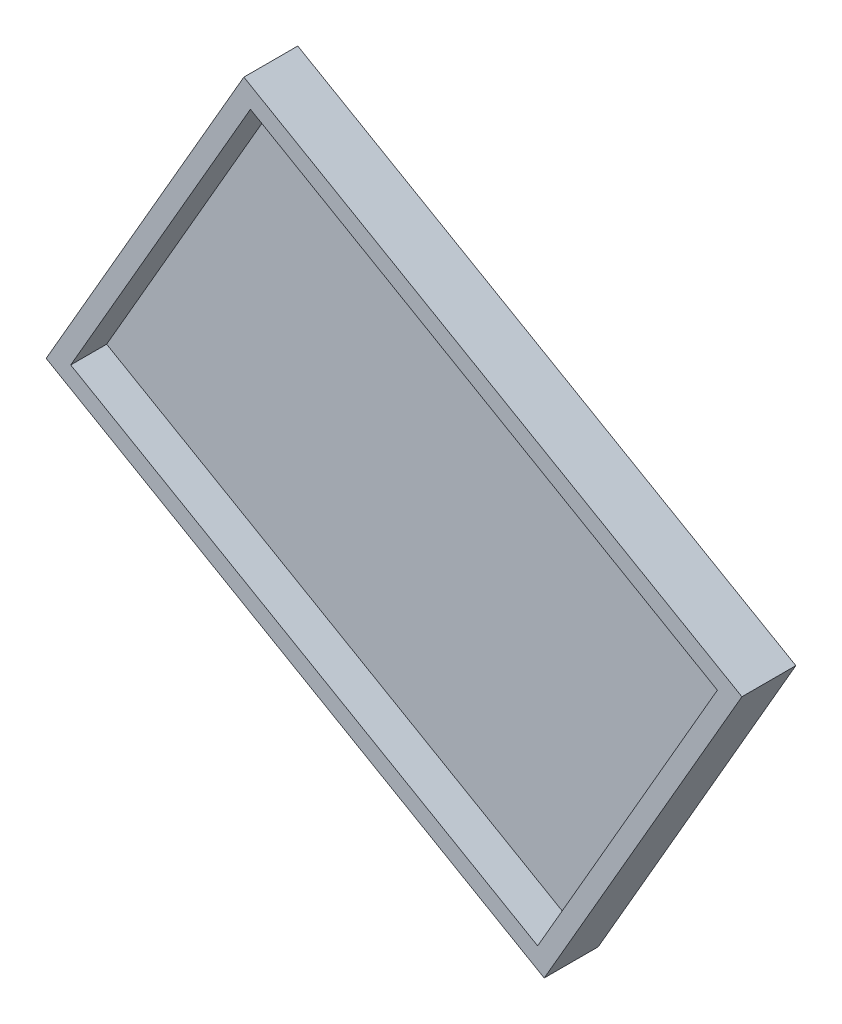
ISO-10303-21;
HEADER;
FILE_DESCRIPTION(('STEP AP214'),'2;1');
FILE_NAME('part.step','',(''),(''),'','','');
FILE_SCHEMA(('AUTOMOTIVE_DESIGN { 1 0 10303 214 1 1 1 1 }'));
ENDSEC;
DATA;
#1=APPLICATION_CONTEXT('core data for automotive mechanical design processes');
#2=APPLICATION_PROTOCOL_DEFINITION('international standard','automotive_design',2000,#1);
#3=PRODUCT_CONTEXT('',#1,'mechanical');
#4=PRODUCT('Part','Part','',(#3));
#5=PRODUCT_RELATED_PRODUCT_CATEGORY('part','',(#4));
#6=PRODUCT_DEFINITION_FORMATION('','',#4);
#7=PRODUCT_DEFINITION_CONTEXT('part definition',#1,'design');
#8=PRODUCT_DEFINITION('design','',#6,#7);
#9=PRODUCT_DEFINITION_SHAPE('','',#8);
#10=(LENGTH_UNIT() NAMED_UNIT(*) SI_UNIT(.MILLI.,.METRE.));
#11=(NAMED_UNIT(*) PLANE_ANGLE_UNIT() SI_UNIT($,.RADIAN.));
#12=(NAMED_UNIT(*) SI_UNIT($,.STERADIAN.) SOLID_ANGLE_UNIT());
#13=UNCERTAINTY_MEASURE_WITH_UNIT(LENGTH_MEASURE(1.E-05),#10,'distance_accuracy_value','');
#14=(GEOMETRIC_REPRESENTATION_CONTEXT(3) GLOBAL_UNCERTAINTY_ASSIGNED_CONTEXT((#13)) GLOBAL_UNIT_ASSIGNED_CONTEXT((#10,
#11,#12)) REPRESENTATION_CONTEXT('',''));
#15=CARTESIAN_POINT('',(0.,0.,0.));
#16=DIRECTION('',(0.,0.,1.));
#17=DIRECTION('',(1.,0.,0.));
#18=AXIS2_PLACEMENT_3D('',#15,#16,#17);
#19=CARTESIAN_POINT('',(20.1313972081438,-75.1313972081442,5.));
#20=DIRECTION('',(0.500000000000004,0.866025403784436,0.));
#21=DIRECTION('',(-0.866025403784436,0.500000000000004,0.));
#22=AXIS2_PLACEMENT_3D('',#19,#20,#21);
#23=PLANE('',#22);
#24=DIRECTION('',(0.866025403784436,-0.500000000000004,0.));
#25=VECTOR('',#24,1.);
#26=CARTESIAN_POINT('',(20.1313972081438,-75.1313972081442,0.));
#27=LINE('',#26,#25);
#28=CARTESIAN_POINT('',(20.1313972081438,-75.1313972081442,0.));
#29=VERTEX_POINT('',#28);
#30=CARTESIAN_POINT('',(158.695461813654,-155.131397208145,0.));
#31=VERTEX_POINT('',#30);
#32=EDGE_CURVE('E148',#29,#31,#27,.T.);
#33=ORIENTED_EDGE('',*,*,#32,.T.);
#34=DIRECTION('',(0.,0.,-1.));
#35=VECTOR('',#34,1.);
#36=CARTESIAN_POINT('',(158.695461813654,-155.131397208145,5.));
#37=LINE('',#36,#35);
#38=CARTESIAN_POINT('',(158.695461813654,-155.131397208145,15.));
#39=VERTEX_POINT('',#38);
#40=EDGE_CURVE('E11',#39,#31,#37,.T.);
#41=ORIENTED_EDGE('',*,*,#40,.F.);
#42=DIRECTION('',(0.866025403784436,-0.500000000000004,0.));
#43=VECTOR('',#42,1.);
#44=CARTESIAN_POINT('',(20.1313972081438,-75.1313972081442,15.));
#45=LINE('',#44,#43);
#46=CARTESIAN_POINT('',(20.1313972081438,-75.1313972081442,15.));
#47=VERTEX_POINT('',#46);
#48=EDGE_CURVE('E142',#47,#39,#45,.T.);
#49=ORIENTED_EDGE('',*,*,#48,.F.);
#50=DIRECTION('',(0.,0.,-1.));
#51=VECTOR('',#50,1.);
#52=CARTESIAN_POINT('',(20.1313972081438,-75.1313972081442,5.));
#53=LINE('',#52,#51);
#54=EDGE_CURVE('E157',#47,#29,#53,.T.);
#55=ORIENTED_EDGE('',*,*,#54,.T.);
#56=EDGE_LOOP('',(#33,#41,#49,#55));
#57=FACE_BOUND('',#56,.T.);
#58=ADVANCED_FACE('F37',(#57),#23,.F.);
#59=CARTESIAN_POINT('',(158.695461813654,-155.131397208145,5.));
#60=DIRECTION('',(-0.866025403784436,0.500000000000004,0.));
#61=DIRECTION('',(-0.500000000000004,-0.866025403784436,0.));
#62=AXIS2_PLACEMENT_3D('',#59,#60,#61);
#63=PLANE('',#62);
#64=DIRECTION('',(0.500000000000004,0.866025403784436,0.));
#65=VECTOR('',#64,1.);
#66=CARTESIAN_POINT('',(158.695461813654,-155.131397208145,0.));
#67=LINE('',#66,#65);
#68=CARTESIAN_POINT('',(213.695461813654,-59.8686027918569,0.));
#69=VERTEX_POINT('',#68);
#70=EDGE_CURVE('E151',#31,#69,#67,.T.);
#71=ORIENTED_EDGE('',*,*,#70,.T.);
#72=DIRECTION('',(0.,0.,-1.));
#73=VECTOR('',#72,1.);
#74=CARTESIAN_POINT('',(213.695461813654,-59.8686027918569,5.));
#75=LINE('',#74,#73);
#76=CARTESIAN_POINT('',(213.695461813654,-59.8686027918569,15.));
#77=VERTEX_POINT('',#76);
#78=EDGE_CURVE('E44',#77,#69,#75,.T.);
#79=ORIENTED_EDGE('',*,*,#78,.F.);
#80=DIRECTION('',(0.500000000000004,0.866025403784436,0.));
#81=VECTOR('',#80,1.);
#82=CARTESIAN_POINT('',(158.695461813654,-155.131397208145,15.));
#83=LINE('',#82,#81);
#84=EDGE_CURVE('E145',#39,#77,#83,.T.);
#85=ORIENTED_EDGE('',*,*,#84,.F.);
#86=ORIENTED_EDGE('',*,*,#40,.T.);
#87=EDGE_LOOP('',(#71,#79,#85,#86));
#88=FACE_BOUND('',#87,.T.);
#89=ADVANCED_FACE('F179',(#88),#63,.F.);
#90=CARTESIAN_POINT('',(213.695461813654,-59.8686027918569,5.));
#91=DIRECTION('',(-0.500000000000004,-0.866025403784436,0.));
#92=DIRECTION('',(0.866025403784436,-0.500000000000004,0.));
#93=AXIS2_PLACEMENT_3D('',#90,#91,#92);
#94=PLANE('',#93);
#95=DIRECTION('',(-0.866025403784436,0.500000000000004,0.));
#96=VECTOR('',#95,1.);
#97=CARTESIAN_POINT('',(213.695461813654,-59.8686027918569,0.));
#98=LINE('',#97,#96);
#99=CARTESIAN_POINT('',(75.1313972081442,20.1313972081438,0.));
#100=VERTEX_POINT('',#99);
#101=EDGE_CURVE('E153',#69,#100,#98,.T.);
#102=ORIENTED_EDGE('',*,*,#101,.T.);
#103=DIRECTION('',(0.,0.,-1.));
#104=VECTOR('',#103,1.);
#105=CARTESIAN_POINT('',(75.1313972081442,20.1313972081438,5.));
#106=LINE('',#105,#104);
#107=CARTESIAN_POINT('',(75.1313972081442,20.1313972081438,15.));
#108=VERTEX_POINT('',#107);
#109=EDGE_CURVE('E160',#108,#100,#106,.T.);
#110=ORIENTED_EDGE('',*,*,#109,.F.);
#111=DIRECTION('',(-0.866025403784436,0.500000000000004,0.));
#112=VECTOR('',#111,1.);
#113=CARTESIAN_POINT('',(213.695461813654,-59.8686027918569,15.));
#114=LINE('',#113,#112);
#115=EDGE_CURVE('E115',#77,#108,#114,.T.);
#116=ORIENTED_EDGE('',*,*,#115,.F.);
#117=ORIENTED_EDGE('',*,*,#78,.T.);
#118=EDGE_LOOP('',(#102,#110,#116,#117));
#119=FACE_BOUND('',#118,.T.);
#120=ADVANCED_FACE('F166',(#119),#94,.F.);
#121=CARTESIAN_POINT('',(75.1313972081442,20.1313972081438,5.));
#122=DIRECTION('',(0.866025403784436,-0.500000000000004,0.));
#123=DIRECTION('',(0.500000000000004,0.866025403784436,0.));
#124=AXIS2_PLACEMENT_3D('',#121,#122,#123);
#125=PLANE('',#124);
#126=DIRECTION('',(-0.500000000000004,-0.866025403784436,0.));
#127=VECTOR('',#126,1.);
#128=CARTESIAN_POINT('',(75.1313972081442,20.1313972081438,0.));
#129=LINE('',#128,#127);
#130=EDGE_CURVE('E155',#100,#29,#129,.T.);
#131=ORIENTED_EDGE('',*,*,#130,.T.);
#132=ORIENTED_EDGE('',*,*,#54,.F.);
#133=DIRECTION('',(-0.500000000000004,-0.866025403784436,0.));
#134=VECTOR('',#133,1.);
#135=CARTESIAN_POINT('',(75.1313972081442,20.1313972081438,15.));
#136=LINE('',#135,#134);
#137=EDGE_CURVE('E139',#108,#47,#136,.T.);
#138=ORIENTED_EDGE('',*,*,#137,.F.);
#139=ORIENTED_EDGE('',*,*,#109,.T.);
#140=EDGE_LOOP('',(#131,#132,#138,#139));
#141=FACE_BOUND('',#140,.T.);
#142=ADVANCED_FACE('F174',(#141),#125,.F.);
#143=CARTESIAN_POINT('',(0.,0.,0.));
#144=DIRECTION('',(0.,0.,1.));
#145=DIRECTION('',(1.,0.,0.));
#146=AXIS2_PLACEMENT_3D('',#143,#144,#145);
#147=PLANE('',#146);
#148=ORIENTED_EDGE('',*,*,#32,.F.);
#149=ORIENTED_EDGE('',*,*,#130,.F.);
#150=ORIENTED_EDGE('',*,*,#101,.F.);
#151=ORIENTED_EDGE('',*,*,#70,.F.);
#152=EDGE_LOOP('',(#148,#149,#150,#151));
#153=FACE_BOUND('',#152,.T.);
#154=ADVANCED_FACE('F172',(#153),#147,.F.);
#155=CARTESIAN_POINT('',(0.,0.,15.));
#156=DIRECTION('',(0.,0.,1.));
#157=DIRECTION('',(1.,0.,0.));
#158=AXIS2_PLACEMENT_3D('',#155,#156,#157);
#159=PLANE('',#158);
#160=ORIENTED_EDGE('',*,*,#115,.T.);
#161=ORIENTED_EDGE('',*,*,#137,.T.);
#162=ORIENTED_EDGE('',*,*,#48,.T.);
#163=ORIENTED_EDGE('',*,*,#84,.T.);
#164=EDGE_LOOP('',(#160,#161,#162,#163));
#165=FACE_BOUND('',#164,.T.);
#166=DIRECTION('',(0.866025403784436,-0.500000000000004,0.));
#167=VECTOR('',#166,1.);
#168=CARTESIAN_POINT('',(26.961524227066,-73.3012701892221,15.));
#169=LINE('',#168,#167);
#170=CARTESIAN_POINT('',(26.961524227066,-73.3012701892221,15.));
#171=VERTEX_POINT('',#170);
#172=CARTESIAN_POINT('',(156.865334794731,-148.301270189223,15.));
#173=VERTEX_POINT('',#172);
#174=EDGE_CURVE('E109',#171,#173,#169,.T.);
#175=ORIENTED_EDGE('',*,*,#174,.F.);
#176=DIRECTION('',(-0.500000000000004,-0.866025403784436,0.));
#177=VECTOR('',#176,1.);
#178=CARTESIAN_POINT('',(76.9615242270664,13.3012701892216,15.));
#179=LINE('',#178,#177);
#180=CARTESIAN_POINT('',(76.9615242270664,13.3012701892216,15.));
#181=VERTEX_POINT('',#180);
#182=EDGE_CURVE('E100',#181,#171,#179,.T.);
#183=ORIENTED_EDGE('',*,*,#182,.F.);
#184=DIRECTION('',(-0.866025403784436,0.500000000000004,0.));
#185=VECTOR('',#184,1.);
#186=CARTESIAN_POINT('',(206.865334794732,-61.698729810779,15.));
#187=LINE('',#186,#185);
#188=CARTESIAN_POINT('',(206.865334794732,-61.698729810779,15.));
#189=VERTEX_POINT('',#188);
#190=EDGE_CURVE('E123',#189,#181,#187,.T.);
#191=ORIENTED_EDGE('',*,*,#190,.F.);
#192=DIRECTION('',(0.500000000000004,0.866025403784436,0.));
#193=VECTOR('',#192,1.);
#194=CARTESIAN_POINT('',(156.865334794731,-148.301270189223,15.));
#195=LINE('',#194,#193);
#196=EDGE_CURVE('E121',#173,#189,#195,.T.);
#197=ORIENTED_EDGE('',*,*,#196,.F.);
#198=EDGE_LOOP('',(#175,#183,#191,#197));
#199=FACE_BOUND('',#198,.T.);
#200=ADVANCED_FACE('F119',(#165,#199),#159,.T.);
#201=CARTESIAN_POINT('',(76.9615242270664,13.3012701892216,15.));
#202=DIRECTION('',(0.866025403784436,-0.500000000000004,0.));
#203=DIRECTION('',(0.500000000000004,0.866025403784436,0.));
#204=AXIS2_PLACEMENT_3D('',#201,#202,#203);
#205=PLANE('',#204);
#206=DIRECTION('',(-0.500000000000004,-0.866025403784436,0.));
#207=VECTOR('',#206,1.);
#208=CARTESIAN_POINT('',(76.9615242270664,13.3012701892216,5.));
#209=LINE('',#208,#207);
#210=CARTESIAN_POINT('',(76.9615242270664,13.3012701892216,5.));
#211=VERTEX_POINT('',#210);
#212=CARTESIAN_POINT('',(26.961524227066,-73.3012701892221,5.));
#213=VERTEX_POINT('',#212);
#214=EDGE_CURVE('E51',#211,#213,#209,.T.);
#215=ORIENTED_EDGE('',*,*,#214,.F.);
#216=DIRECTION('',(0.,0.,-1.));
#217=VECTOR('',#216,1.);
#218=CARTESIAN_POINT('',(76.9615242270664,13.3012701892216,15.));
#219=LINE('',#218,#217);
#220=EDGE_CURVE('E105',#181,#211,#219,.T.);
#221=ORIENTED_EDGE('',*,*,#220,.F.);
#222=ORIENTED_EDGE('',*,*,#182,.T.);
#223=DIRECTION('',(0.,0.,-1.));
#224=VECTOR('',#223,1.);
#225=CARTESIAN_POINT('',(26.961524227066,-73.3012701892221,15.));
#226=LINE('',#225,#224);
#227=EDGE_CURVE('E103',#171,#213,#226,.T.);
#228=ORIENTED_EDGE('',*,*,#227,.T.);
#229=EDGE_LOOP('',(#215,#221,#222,#228));
#230=FACE_BOUND('',#229,.T.);
#231=ADVANCED_FACE('F102',(#230),#205,.T.);
#232=CARTESIAN_POINT('',(26.961524227066,-73.3012701892221,15.));
#233=DIRECTION('',(0.500000000000004,0.866025403784436,0.));
#234=DIRECTION('',(-0.866025403784436,0.500000000000004,0.));
#235=AXIS2_PLACEMENT_3D('',#232,#233,#234);
#236=PLANE('',#235);
#237=DIRECTION('',(0.866025403784436,-0.500000000000004,0.));
#238=VECTOR('',#237,1.);
#239=CARTESIAN_POINT('',(26.961524227066,-73.3012701892221,5.));
#240=LINE('',#239,#238);
#241=CARTESIAN_POINT('',(156.865334794731,-148.301270189223,5.));
#242=VERTEX_POINT('',#241);
#243=EDGE_CURVE('E55',#213,#242,#240,.T.);
#244=ORIENTED_EDGE('',*,*,#243,.F.);
#245=ORIENTED_EDGE('',*,*,#227,.F.);
#246=ORIENTED_EDGE('',*,*,#174,.T.);
#247=DIRECTION('',(0.,0.,-1.));
#248=VECTOR('',#247,1.);
#249=CARTESIAN_POINT('',(156.865334794731,-148.301270189223,15.));
#250=LINE('',#249,#248);
#251=EDGE_CURVE('E116',#173,#242,#250,.T.);
#252=ORIENTED_EDGE('',*,*,#251,.T.);
#253=EDGE_LOOP('',(#244,#245,#246,#252));
#254=FACE_BOUND('',#253,.T.);
#255=ADVANCED_FACE('F113',(#254),#236,.T.);
#256=CARTESIAN_POINT('',(156.865334794731,-148.301270189223,15.));
#257=DIRECTION('',(-0.866025403784436,0.500000000000004,0.));
#258=DIRECTION('',(-0.500000000000004,-0.866025403784436,0.));
#259=AXIS2_PLACEMENT_3D('',#256,#257,#258);
#260=PLANE('',#259);
#261=DIRECTION('',(0.500000000000004,0.866025403784436,0.));
#262=VECTOR('',#261,1.);
#263=CARTESIAN_POINT('',(156.865334794731,-148.301270189223,5.));
#264=LINE('',#263,#262);
#265=CARTESIAN_POINT('',(206.865334794732,-61.698729810779,5.));
#266=VERTEX_POINT('',#265);
#267=EDGE_CURVE('E129',#242,#266,#264,.T.);
#268=ORIENTED_EDGE('',*,*,#267,.F.);
#269=ORIENTED_EDGE('',*,*,#251,.F.);
#270=ORIENTED_EDGE('',*,*,#196,.T.);
#271=DIRECTION('',(0.,0.,-1.));
#272=VECTOR('',#271,1.);
#273=CARTESIAN_POINT('',(206.865334794732,-61.698729810779,15.));
#274=LINE('',#273,#272);
#275=EDGE_CURVE('E133',#189,#266,#274,.T.);
#276=ORIENTED_EDGE('',*,*,#275,.T.);
#277=EDGE_LOOP('',(#268,#269,#270,#276));
#278=FACE_BOUND('',#277,.T.);
#279=ADVANCED_FACE('F201',(#278),#260,.T.);
#280=CARTESIAN_POINT('',(206.865334794732,-61.698729810779,15.));
#281=DIRECTION('',(-0.500000000000004,-0.866025403784436,0.));
#282=DIRECTION('',(0.866025403784436,-0.500000000000004,0.));
#283=AXIS2_PLACEMENT_3D('',#280,#281,#282);
#284=PLANE('',#283);
#285=DIRECTION('',(-0.866025403784436,0.500000000000004,0.));
#286=VECTOR('',#285,1.);
#287=CARTESIAN_POINT('',(206.865334794732,-61.698729810779,5.));
#288=LINE('',#287,#286);
#289=EDGE_CURVE('E110',#266,#211,#288,.T.);
#290=ORIENTED_EDGE('',*,*,#289,.F.);
#291=ORIENTED_EDGE('',*,*,#275,.F.);
#292=ORIENTED_EDGE('',*,*,#190,.T.);
#293=ORIENTED_EDGE('',*,*,#220,.T.);
#294=EDGE_LOOP('',(#290,#291,#292,#293));
#295=FACE_BOUND('',#294,.T.);
#296=ADVANCED_FACE('F194',(#295),#284,.T.);
#297=CARTESIAN_POINT('',(0.,0.,5.));
#298=DIRECTION('',(0.,0.,1.));
#299=DIRECTION('',(1.,0.,0.));
#300=AXIS2_PLACEMENT_3D('',#297,#298,#299);
#301=PLANE('',#300);
#302=ORIENTED_EDGE('',*,*,#214,.T.);
#303=ORIENTED_EDGE('',*,*,#243,.T.);
#304=ORIENTED_EDGE('',*,*,#267,.T.);
#305=ORIENTED_EDGE('',*,*,#289,.T.);
#306=EDGE_LOOP('',(#302,#303,#304,#305));
#307=FACE_BOUND('',#306,.T.);
#308=ADVANCED_FACE('F191',(#307),#301,.T.);
#309=CLOSED_SHELL('',(#58,#89,#120,#142,#154,#200,#231,#255,#279,#296,#308));
#310=MANIFOLD_SOLID_BREP('B2',#309);
#311=ADVANCED_BREP_SHAPE_REPRESENTATION('',(#18,#310),#14);
#312=SHAPE_DEFINITION_REPRESENTATION(#9,#311);
ENDSEC;
END-ISO-10303-21;
